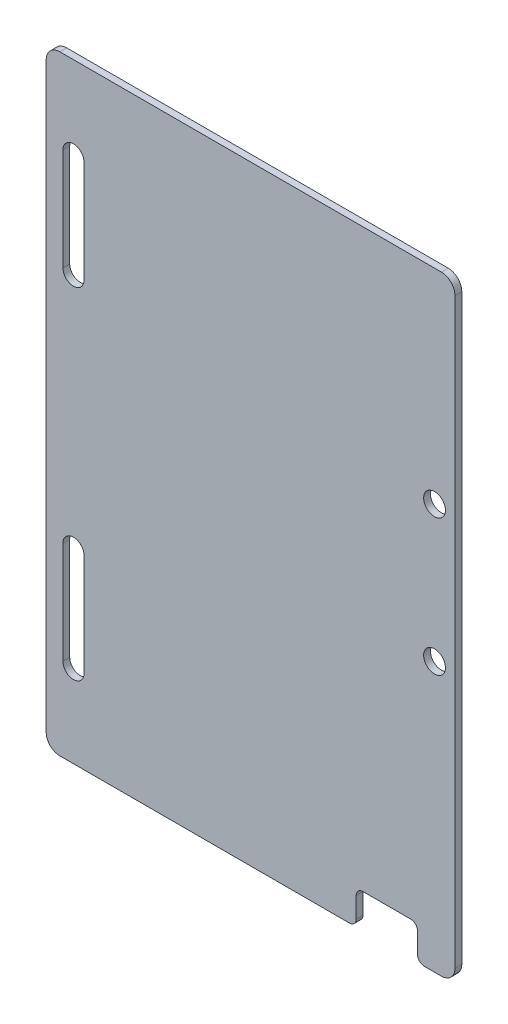
ISO-10303-21;
HEADER;
FILE_DESCRIPTION(('STEP AP214'),'2;1');
FILE_NAME('part.step','',(''),(''),'','','');
FILE_SCHEMA(('AUTOMOTIVE_DESIGN { 1 0 10303 214 1 1 1 1 }'));
ENDSEC;
DATA;
#1=APPLICATION_CONTEXT('core data for automotive mechanical design processes');
#2=APPLICATION_PROTOCOL_DEFINITION('international standard','automotive_design',2000,#1);
#3=PRODUCT_CONTEXT('',#1,'mechanical');
#4=PRODUCT('Part','Part','',(#3));
#5=PRODUCT_RELATED_PRODUCT_CATEGORY('part','',(#4));
#6=PRODUCT_DEFINITION_FORMATION('','',#4);
#7=PRODUCT_DEFINITION_CONTEXT('part definition',#1,'design');
#8=PRODUCT_DEFINITION('design','',#6,#7);
#9=PRODUCT_DEFINITION_SHAPE('','',#8);
#10=(LENGTH_UNIT() NAMED_UNIT(*) SI_UNIT(.MILLI.,.METRE.));
#11=(NAMED_UNIT(*) PLANE_ANGLE_UNIT() SI_UNIT($,.RADIAN.));
#12=(NAMED_UNIT(*) SI_UNIT($,.STERADIAN.) SOLID_ANGLE_UNIT());
#13=UNCERTAINTY_MEASURE_WITH_UNIT(LENGTH_MEASURE(1.E-05),#10,'distance_accuracy_value','');
#14=(GEOMETRIC_REPRESENTATION_CONTEXT(3) GLOBAL_UNCERTAINTY_ASSIGNED_CONTEXT((#13)) GLOBAL_UNIT_ASSIGNED_CONTEXT((#10,
#11,#12)) REPRESENTATION_CONTEXT('',''));
#15=CARTESIAN_POINT('',(0.,0.,0.));
#16=DIRECTION('',(0.,0.,1.));
#17=DIRECTION('',(1.,0.,0.));
#18=AXIS2_PLACEMENT_3D('',#15,#16,#17);
#19=CARTESIAN_POINT('',(-30.,-44.75,1.));
#20=DIRECTION('',(0.,1.,0.));
#21=DIRECTION('',(0.,0.,1.));
#22=AXIS2_PLACEMENT_3D('',#19,#20,#21);
#23=PLANE('',#22);
#24=DIRECTION('',(1.,0.,0.));
#25=VECTOR('',#24,1.);
#26=CARTESIAN_POINT('',(-30.,-44.75,0.));
#27=LINE('',#26,#25);
#28=CARTESIAN_POINT('',(-28.,-44.75,0.));
#29=VERTEX_POINT('',#28);
#30=CARTESIAN_POINT('',(14.5,-44.75,0.));
#31=VERTEX_POINT('',#30);
#32=EDGE_CURVE('E270',#29,#31,#27,.T.);
#33=ORIENTED_EDGE('',*,*,#32,.T.);
#34=DIRECTION('',(0.,0.,1.));
#35=VECTOR('',#34,1.);
#36=CARTESIAN_POINT('',(14.5,-44.75,1.));
#37=LINE('',#36,#35);
#38=CARTESIAN_POINT('',(14.5,-44.75,1.));
#39=VERTEX_POINT('',#38);
#40=EDGE_CURVE('E359',#31,#39,#37,.T.);
#41=ORIENTED_EDGE('',*,*,#40,.T.);
#42=DIRECTION('',(1.,0.,0.));
#43=VECTOR('',#42,1.);
#44=CARTESIAN_POINT('',(-30.,-44.75,1.));
#45=LINE('',#44,#43);
#46=CARTESIAN_POINT('',(-28.,-44.75,1.));
#47=VERTEX_POINT('',#46);
#48=EDGE_CURVE('E277',#47,#39,#45,.T.);
#49=ORIENTED_EDGE('',*,*,#48,.F.);
#50=DIRECTION('',(0.,0.,-1.));
#51=VECTOR('',#50,1.);
#52=CARTESIAN_POINT('',(-28.,-44.75,1.));
#53=LINE('',#52,#51);
#54=EDGE_CURVE('E321',#47,#29,#53,.T.);
#55=ORIENTED_EDGE('',*,*,#54,.T.);
#56=EDGE_LOOP('',(#33,#41,#49,#55));
#57=FACE_BOUND('',#56,.T.);
#58=ADVANCED_FACE('F35',(#57),#23,.F.);
#59=CARTESIAN_POINT('',(0.,0.,1.));
#60=DIRECTION('',(0.,0.,-1.));
#61=DIRECTION('',(-1.,0.,0.));
#62=AXIS2_PLACEMENT_3D('',#59,#60,#61);
#63=PLANE('',#62);
#64=ORIENTED_EDGE('',*,*,#48,.T.);
#65=CARTESIAN_POINT('',(14.5,-43.75,1.));
#66=DIRECTION('',(0.,0.,-1.));
#67=DIRECTION('',(-1.,0.,0.));
#68=AXIS2_PLACEMENT_3D('',#65,#66,#67);
#69=CIRCLE('',#68,1.);
#70=CARTESIAN_POINT('',(15.5,-43.75,1.));
#71=VERTEX_POINT('',#70);
#72=EDGE_CURVE('E363',#39,#71,#69,.F.);
#73=ORIENTED_EDGE('',*,*,#72,.T.);
#74=DIRECTION('',(0.,1.,0.));
#75=VECTOR('',#74,1.);
#76=CARTESIAN_POINT('',(15.5,0.,1.));
#77=LINE('',#76,#75);
#78=CARTESIAN_POINT('',(15.5,-40.75,1.));
#79=VERTEX_POINT('',#78);
#80=EDGE_CURVE('E397',#71,#79,#77,.T.);
#81=ORIENTED_EDGE('',*,*,#80,.T.);
#82=CARTESIAN_POINT('',(16.5,-40.75,0.999999999999999));
#83=DIRECTION('',(0.,0.,-1.));
#84=DIRECTION('',(-1.,0.,0.));
#85=AXIS2_PLACEMENT_3D('',#82,#83,#84);
#86=CIRCLE('',#85,1.);
#87=CARTESIAN_POINT('',(16.5,-39.75,1.));
#88=VERTEX_POINT('',#87);
#89=EDGE_CURVE('E11',#79,#88,#86,.T.);
#90=ORIENTED_EDGE('',*,*,#89,.T.);
#91=DIRECTION('',(1.,0.,0.));
#92=VECTOR('',#91,1.);
#93=CARTESIAN_POINT('',(0.,-39.75,1.));
#94=LINE('',#93,#92);
#95=CARTESIAN_POINT('',(23.5,-39.75,1.));
#96=VERTEX_POINT('',#95);
#97=EDGE_CURVE('E236',#88,#96,#94,.T.);
#98=ORIENTED_EDGE('',*,*,#97,.T.);
#99=CARTESIAN_POINT('',(23.5,-40.75,0.999999999999999));
#100=DIRECTION('',(0.,0.,-1.));
#101=DIRECTION('',(-1.,0.,0.));
#102=AXIS2_PLACEMENT_3D('',#99,#100,#101);
#103=CIRCLE('',#102,1.);
#104=CARTESIAN_POINT('',(24.5,-40.75,1.));
#105=VERTEX_POINT('',#104);
#106=EDGE_CURVE('E372',#96,#105,#103,.T.);
#107=ORIENTED_EDGE('',*,*,#106,.T.);
#108=DIRECTION('',(0.,-1.,0.));
#109=VECTOR('',#108,1.);
#110=CARTESIAN_POINT('',(24.5,0.,1.));
#111=LINE('',#110,#109);
#112=CARTESIAN_POINT('',(24.5,-43.75,1.));
#113=VERTEX_POINT('',#112);
#114=EDGE_CURVE('E402',#105,#113,#111,.T.);
#115=ORIENTED_EDGE('',*,*,#114,.T.);
#116=CARTESIAN_POINT('',(25.5,-43.75,1.));
#117=DIRECTION('',(0.,0.,-1.));
#118=DIRECTION('',(-1.,0.,0.));
#119=AXIS2_PLACEMENT_3D('',#116,#117,#118);
#120=CIRCLE('',#119,1.);
#121=CARTESIAN_POINT('',(25.5,-44.75,1.));
#122=VERTEX_POINT('',#121);
#123=EDGE_CURVE('E58',#113,#122,#120,.F.);
#124=ORIENTED_EDGE('',*,*,#123,.T.);
#125=CARTESIAN_POINT('',(28.,-44.75,1.));
#126=VERTEX_POINT('',#125);
#127=EDGE_CURVE('E276',#122,#126,#45,.T.);
#128=ORIENTED_EDGE('',*,*,#127,.T.);
#129=CARTESIAN_POINT('',(28.,-42.75,1.));
#130=DIRECTION('',(0.,0.,-1.));
#131=DIRECTION('',(-1.,0.,0.));
#132=AXIS2_PLACEMENT_3D('',#129,#130,#131);
#133=CIRCLE('',#132,2.);
#134=CARTESIAN_POINT('',(30.,-42.75,1.));
#135=VERTEX_POINT('',#134);
#136=EDGE_CURVE('E333',#126,#135,#133,.F.);
#137=ORIENTED_EDGE('',*,*,#136,.T.);
#138=DIRECTION('',(0.,1.,0.));
#139=VECTOR('',#138,1.);
#140=CARTESIAN_POINT('',(30.,-44.75,1.));
#141=LINE('',#140,#139);
#142=CARTESIAN_POINT('',(30.,42.75,1.));
#143=VERTEX_POINT('',#142);
#144=EDGE_CURVE('E266',#135,#143,#141,.T.);
#145=ORIENTED_EDGE('',*,*,#144,.T.);
#146=CARTESIAN_POINT('',(28.,42.75,1.));
#147=DIRECTION('',(0.,0.,-1.));
#148=DIRECTION('',(-1.,0.,0.));
#149=AXIS2_PLACEMENT_3D('',#146,#147,#148);
#150=CIRCLE('',#149,2.);
#151=CARTESIAN_POINT('',(28.,44.75,1.));
#152=VERTEX_POINT('',#151);
#153=EDGE_CURVE('E329',#143,#152,#150,.F.);
#154=ORIENTED_EDGE('',*,*,#153,.T.);
#155=DIRECTION('',(-1.,0.,0.));
#156=VECTOR('',#155,1.);
#157=CARTESIAN_POINT('',(-30.,44.75,1.));
#158=LINE('',#157,#156);
#159=CARTESIAN_POINT('',(-28.,44.75,1.));
#160=VERTEX_POINT('',#159);
#161=EDGE_CURVE('E269',#152,#160,#158,.T.);
#162=ORIENTED_EDGE('',*,*,#161,.T.);
#163=CARTESIAN_POINT('',(-28.,42.75,1.));
#164=DIRECTION('',(0.,0.,-1.));
#165=DIRECTION('',(-1.,0.,0.));
#166=AXIS2_PLACEMENT_3D('',#163,#164,#165);
#167=CIRCLE('',#166,2.);
#168=CARTESIAN_POINT('',(-30.,42.75,1.));
#169=VERTEX_POINT('',#168);
#170=EDGE_CURVE('E327',#160,#169,#167,.F.);
#171=ORIENTED_EDGE('',*,*,#170,.T.);
#172=DIRECTION('',(0.,-1.,0.));
#173=VECTOR('',#172,1.);
#174=CARTESIAN_POINT('',(-30.,-44.75,1.));
#175=LINE('',#174,#173);
#176=CARTESIAN_POINT('',(-30.,-42.75,1.));
#177=VERTEX_POINT('',#176);
#178=EDGE_CURVE('E273',#169,#177,#175,.T.);
#179=ORIENTED_EDGE('',*,*,#178,.T.);
#180=CARTESIAN_POINT('',(-28.,-42.75,1.));
#181=DIRECTION('',(0.,0.,-1.));
#182=DIRECTION('',(-1.,0.,0.));
#183=AXIS2_PLACEMENT_3D('',#180,#181,#182);
#184=CIRCLE('',#183,2.);
#185=EDGE_CURVE('E331',#177,#47,#184,.F.);
#186=ORIENTED_EDGE('',*,*,#185,.T.);
#187=EDGE_LOOP('',(#64,#73,#81,#90,#98,#107,#115,#124,#128,#137,#145,#154,#162,#171,#179,#186));
#188=FACE_BOUND('',#187,.T.);
#189=DIRECTION('',(0.,-1.,0.));
#190=VECTOR('',#189,1.);
#191=CARTESIAN_POINT('',(-27.55,32.5,1.));
#192=LINE('',#191,#190);
#193=CARTESIAN_POINT('',(-27.55,32.5,1.));
#194=VERTEX_POINT('',#193);
#195=CARTESIAN_POINT('',(-27.55,17.5,1.));
#196=VERTEX_POINT('',#195);
#197=EDGE_CURVE('E213',#194,#196,#192,.T.);
#198=ORIENTED_EDGE('',*,*,#197,.F.);
#199=CARTESIAN_POINT('',(-26.,32.5,1.));
#200=DIRECTION('',(0.,0.,1.));
#201=DIRECTION('',(1.,0.,0.));
#202=AXIS2_PLACEMENT_3D('',#199,#200,#201);
#203=CIRCLE('',#202,1.55);
#204=CARTESIAN_POINT('',(-24.45,32.5,1.));
#205=VERTEX_POINT('',#204);
#206=EDGE_CURVE('E218',#205,#194,#203,.T.);
#207=ORIENTED_EDGE('',*,*,#206,.F.);
#208=DIRECTION('',(0.,1.,0.));
#209=VECTOR('',#208,1.);
#210=CARTESIAN_POINT('',(-24.45,32.5,1.));
#211=LINE('',#210,#209);
#212=CARTESIAN_POINT('',(-24.45,17.5,1.));
#213=VERTEX_POINT('',#212);
#214=EDGE_CURVE('E223',#213,#205,#211,.T.);
#215=ORIENTED_EDGE('',*,*,#214,.F.);
#216=CARTESIAN_POINT('',(-26.,17.5,1.));
#217=DIRECTION('',(0.,0.,1.));
#218=DIRECTION('',(1.,0.,0.));
#219=AXIS2_PLACEMENT_3D('',#216,#217,#218);
#220=CIRCLE('',#219,1.55);
#221=EDGE_CURVE('E202',#196,#213,#220,.T.);
#222=ORIENTED_EDGE('',*,*,#221,.F.);
#223=EDGE_LOOP('',(#198,#207,#215,#222));
#224=FACE_BOUND('',#223,.T.);
#225=DIRECTION('',(0.,-1.,0.));
#226=VECTOR('',#225,1.);
#227=CARTESIAN_POINT('',(-27.55,-17.5,1.));
#228=LINE('',#227,#226);
#229=CARTESIAN_POINT('',(-27.55,-17.5,1.));
#230=VERTEX_POINT('',#229);
#231=CARTESIAN_POINT('',(-27.55,-32.5,1.));
#232=VERTEX_POINT('',#231);
#233=EDGE_CURVE('E235',#230,#232,#228,.T.);
#234=ORIENTED_EDGE('',*,*,#233,.F.);
#235=CARTESIAN_POINT('',(-26.,-17.5,1.));
#236=DIRECTION('',(0.,0.,1.));
#237=DIRECTION('',(1.,0.,0.));
#238=AXIS2_PLACEMENT_3D('',#235,#236,#237);
#239=CIRCLE('',#238,1.55);
#240=CARTESIAN_POINT('',(-24.45,-17.5,1.));
#241=VERTEX_POINT('',#240);
#242=EDGE_CURVE('E233',#241,#230,#239,.T.);
#243=ORIENTED_EDGE('',*,*,#242,.F.);
#244=DIRECTION('',(0.,1.,0.));
#245=VECTOR('',#244,1.);
#246=CARTESIAN_POINT('',(-24.45,-17.5,1.));
#247=LINE('',#246,#245);
#248=CARTESIAN_POINT('',(-24.45,-32.5,1.));
#249=VERTEX_POINT('',#248);
#250=EDGE_CURVE('E242',#249,#241,#247,.T.);
#251=ORIENTED_EDGE('',*,*,#250,.F.);
#252=CARTESIAN_POINT('',(-26.,-32.5,1.));
#253=DIRECTION('',(0.,0.,1.));
#254=DIRECTION('',(1.,0.,0.));
#255=AXIS2_PLACEMENT_3D('',#252,#253,#254);
#256=CIRCLE('',#255,1.55);
#257=EDGE_CURVE('E239',#232,#249,#256,.T.);
#258=ORIENTED_EDGE('',*,*,#257,.F.);
#259=EDGE_LOOP('',(#234,#243,#251,#258));
#260=FACE_BOUND('',#259,.T.);
#261=CARTESIAN_POINT('',(27.,14.75,1.));
#262=DIRECTION('',(0.,0.,1.));
#263=DIRECTION('',(1.,0.,0.));
#264=AXIS2_PLACEMENT_3D('',#261,#262,#263);
#265=CIRCLE('',#264,1.6);
#266=CARTESIAN_POINT('',(28.6,14.75,1.));
#267=VERTEX_POINT('',#266);
#268=EDGE_CURVE('E260',#267,#267,#265,.T.);
#269=ORIENTED_EDGE('',*,*,#268,.F.);
#270=EDGE_LOOP('',(#269));
#271=FACE_BOUND('',#270,.T.);
#272=CARTESIAN_POINT('',(27.,-5.25000000000001,1.));
#273=DIRECTION('',(0.,0.,1.));
#274=DIRECTION('',(1.,0.,0.));
#275=AXIS2_PLACEMENT_3D('',#272,#273,#274);
#276=CIRCLE('',#275,1.6);
#277=CARTESIAN_POINT('',(28.6,-5.25000000000001,1.));
#278=VERTEX_POINT('',#277);
#279=EDGE_CURVE('E254',#278,#278,#276,.T.);
#280=ORIENTED_EDGE('',*,*,#279,.F.);
#281=EDGE_LOOP('',(#280));
#282=FACE_BOUND('',#281,.T.);
#283=ADVANCED_FACE('F220',(#188,#224,#260,#271,#282),#63,.F.);
#284=CARTESIAN_POINT('',(0.,0.,0.));
#285=DIRECTION('',(0.,0.,-1.));
#286=DIRECTION('',(-1.,0.,0.));
#287=AXIS2_PLACEMENT_3D('',#284,#285,#286);
#288=PLANE('',#287);
#289=DIRECTION('',(0.,1.,0.));
#290=VECTOR('',#289,1.);
#291=CARTESIAN_POINT('',(15.5,-49.75,0.));
#292=LINE('',#291,#290);
#293=CARTESIAN_POINT('',(15.5,-43.75,0.));
#294=VERTEX_POINT('',#293);
#295=CARTESIAN_POINT('',(15.5,-40.75,0.));
#296=VERTEX_POINT('',#295);
#297=EDGE_CURVE('E379',#294,#296,#292,.T.);
#298=ORIENTED_EDGE('',*,*,#297,.F.);
#299=CARTESIAN_POINT('',(14.5,-43.75,0.));
#300=DIRECTION('',(0.,0.,-1.));
#301=DIRECTION('',(-1.,0.,0.));
#302=AXIS2_PLACEMENT_3D('',#299,#300,#301);
#303=CIRCLE('',#302,1.);
#304=EDGE_CURVE('E366',#294,#31,#303,.T.);
#305=ORIENTED_EDGE('',*,*,#304,.T.);
#306=ORIENTED_EDGE('',*,*,#32,.F.);
#307=CARTESIAN_POINT('',(-28.,-42.75,0.));
#308=DIRECTION('',(0.,0.,-1.));
#309=DIRECTION('',(-1.,0.,0.));
#310=AXIS2_PLACEMENT_3D('',#307,#308,#309);
#311=CIRCLE('',#310,2.);
#312=CARTESIAN_POINT('',(-30.,-42.75,0.));
#313=VERTEX_POINT('',#312);
#314=EDGE_CURVE('E316',#29,#313,#311,.T.);
#315=ORIENTED_EDGE('',*,*,#314,.T.);
#316=DIRECTION('',(0.,-1.,0.));
#317=VECTOR('',#316,1.);
#318=CARTESIAN_POINT('',(-30.,-44.75,0.));
#319=LINE('',#318,#317);
#320=CARTESIAN_POINT('',(-30.,42.75,0.));
#321=VERTEX_POINT('',#320);
#322=EDGE_CURVE('E286',#321,#313,#319,.T.);
#323=ORIENTED_EDGE('',*,*,#322,.F.);
#324=CARTESIAN_POINT('',(-28.,42.75,0.));
#325=DIRECTION('',(0.,0.,-1.));
#326=DIRECTION('',(-1.,0.,0.));
#327=AXIS2_PLACEMENT_3D('',#324,#325,#326);
#328=CIRCLE('',#327,2.);
#329=CARTESIAN_POINT('',(-28.,44.75,0.));
#330=VERTEX_POINT('',#329);
#331=EDGE_CURVE('E312',#321,#330,#328,.T.);
#332=ORIENTED_EDGE('',*,*,#331,.T.);
#333=DIRECTION('',(-1.,0.,0.));
#334=VECTOR('',#333,1.);
#335=CARTESIAN_POINT('',(-30.,44.75,0.));
#336=LINE('',#335,#334);
#337=CARTESIAN_POINT('',(28.,44.75,0.));
#338=VERTEX_POINT('',#337);
#339=EDGE_CURVE('E283',#338,#330,#336,.T.);
#340=ORIENTED_EDGE('',*,*,#339,.F.);
#341=CARTESIAN_POINT('',(28.,42.75,0.));
#342=DIRECTION('',(0.,0.,-1.));
#343=DIRECTION('',(-1.,0.,0.));
#344=AXIS2_PLACEMENT_3D('',#341,#342,#343);
#345=CIRCLE('',#344,2.);
#346=CARTESIAN_POINT('',(30.,42.75,0.));
#347=VERTEX_POINT('',#346);
#348=EDGE_CURVE('E314',#338,#347,#345,.T.);
#349=ORIENTED_EDGE('',*,*,#348,.T.);
#350=DIRECTION('',(0.,1.,0.));
#351=VECTOR('',#350,1.);
#352=CARTESIAN_POINT('',(30.,-44.75,0.));
#353=LINE('',#352,#351);
#354=CARTESIAN_POINT('',(30.,-42.75,0.));
#355=VERTEX_POINT('',#354);
#356=EDGE_CURVE('E263',#355,#347,#353,.T.);
#357=ORIENTED_EDGE('',*,*,#356,.F.);
#358=CARTESIAN_POINT('',(28.,-42.75,0.));
#359=DIRECTION('',(0.,0.,-1.));
#360=DIRECTION('',(-1.,0.,0.));
#361=AXIS2_PLACEMENT_3D('',#358,#359,#360);
#362=CIRCLE('',#361,2.);
#363=CARTESIAN_POINT('',(28.,-44.75,0.));
#364=VERTEX_POINT('',#363);
#365=EDGE_CURVE('E318',#355,#364,#362,.T.);
#366=ORIENTED_EDGE('',*,*,#365,.T.);
#367=CARTESIAN_POINT('',(25.5,-44.75,0.));
#368=VERTEX_POINT('',#367);
#369=EDGE_CURVE('E289',#368,#364,#27,.T.);
#370=ORIENTED_EDGE('',*,*,#369,.F.);
#371=CARTESIAN_POINT('',(25.5,-43.75,0.));
#372=DIRECTION('',(0.,0.,-1.));
#373=DIRECTION('',(-1.,0.,0.));
#374=AXIS2_PLACEMENT_3D('',#371,#372,#373);
#375=CIRCLE('',#374,1.);
#376=CARTESIAN_POINT('',(24.5,-43.75,0.));
#377=VERTEX_POINT('',#376);
#378=EDGE_CURVE('E50',#368,#377,#375,.T.);
#379=ORIENTED_EDGE('',*,*,#378,.T.);
#380=DIRECTION('',(0.,-1.,0.));
#381=VECTOR('',#380,1.);
#382=CARTESIAN_POINT('',(24.5,-49.75,0.));
#383=LINE('',#382,#381);
#384=CARTESIAN_POINT('',(24.5,-40.75,0.));
#385=VERTEX_POINT('',#384);
#386=EDGE_CURVE('E467',#385,#377,#383,.T.);
#387=ORIENTED_EDGE('',*,*,#386,.F.);
#388=CARTESIAN_POINT('',(23.5,-40.75,0.));
#389=DIRECTION('',(0.,0.,-1.));
#390=DIRECTION('',(-1.,0.,0.));
#391=AXIS2_PLACEMENT_3D('',#388,#389,#390);
#392=CIRCLE('',#391,1.);
#393=CARTESIAN_POINT('',(23.5,-39.75,0.));
#394=VERTEX_POINT('',#393);
#395=EDGE_CURVE('E370',#385,#394,#392,.F.);
#396=ORIENTED_EDGE('',*,*,#395,.T.);
#397=DIRECTION('',(1.,0.,0.));
#398=VECTOR('',#397,1.);
#399=CARTESIAN_POINT('',(24.5,-39.75,0.));
#400=LINE('',#399,#398);
#401=CARTESIAN_POINT('',(16.5,-39.75,0.));
#402=VERTEX_POINT('',#401);
#403=EDGE_CURVE('E382',#402,#394,#400,.T.);
#404=ORIENTED_EDGE('',*,*,#403,.F.);
#405=CARTESIAN_POINT('',(16.5,-40.75,0.));
#406=DIRECTION('',(0.,0.,-1.));
#407=DIRECTION('',(-1.,0.,0.));
#408=AXIS2_PLACEMENT_3D('',#405,#406,#407);
#409=CIRCLE('',#408,1.);
#410=EDGE_CURVE('E43',#402,#296,#409,.F.);
#411=ORIENTED_EDGE('',*,*,#410,.T.);
#412=EDGE_LOOP('',(#298,#305,#306,#315,#323,#332,#340,#349,#357,#366,#370,#379,#387,#396,#404,#411));
#413=FACE_BOUND('',#412,.T.);
#414=CARTESIAN_POINT('',(-26.,32.5,0.));
#415=DIRECTION('',(0.,0.,-1.));
#416=DIRECTION('',(-1.,0.,0.));
#417=AXIS2_PLACEMENT_3D('',#414,#415,#416);
#418=CIRCLE('',#417,1.55);
#419=CARTESIAN_POINT('',(-27.55,32.5,0.));
#420=VERTEX_POINT('',#419);
#421=CARTESIAN_POINT('',(-24.45,32.5,0.));
#422=VERTEX_POINT('',#421);
#423=EDGE_CURVE('E305',#420,#422,#418,.T.);
#424=ORIENTED_EDGE('',*,*,#423,.F.);
#425=DIRECTION('',(0.,1.,0.));
#426=VECTOR('',#425,1.);
#427=CARTESIAN_POINT('',(-27.55,0.,0.));
#428=LINE('',#427,#426);
#429=CARTESIAN_POINT('',(-27.55,17.5,0.));
#430=VERTEX_POINT('',#429);
#431=EDGE_CURVE('E300',#430,#420,#428,.T.);
#432=ORIENTED_EDGE('',*,*,#431,.F.);
#433=CARTESIAN_POINT('',(-26.,17.5,0.));
#434=DIRECTION('',(0.,0.,-1.));
#435=DIRECTION('',(-1.,0.,0.));
#436=AXIS2_PLACEMENT_3D('',#433,#434,#435);
#437=CIRCLE('',#436,1.55);
#438=CARTESIAN_POINT('',(-24.45,17.5,0.));
#439=VERTEX_POINT('',#438);
#440=EDGE_CURVE('E205',#439,#430,#437,.T.);
#441=ORIENTED_EDGE('',*,*,#440,.F.);
#442=DIRECTION('',(0.,-1.,0.));
#443=VECTOR('',#442,1.);
#444=CARTESIAN_POINT('',(-24.45,0.,0.));
#445=LINE('',#444,#443);
#446=EDGE_CURVE('E303',#422,#439,#445,.T.);
#447=ORIENTED_EDGE('',*,*,#446,.F.);
#448=EDGE_LOOP('',(#424,#432,#441,#447));
#449=FACE_BOUND('',#448,.T.);
#450=CARTESIAN_POINT('',(-26.,-17.5,0.));
#451=DIRECTION('',(0.,0.,-1.));
#452=DIRECTION('',(-1.,0.,0.));
#453=AXIS2_PLACEMENT_3D('',#450,#451,#452);
#454=CIRCLE('',#453,1.55);
#455=CARTESIAN_POINT('',(-27.55,-17.5,0.));
#456=VERTEX_POINT('',#455);
#457=CARTESIAN_POINT('',(-24.45,-17.5,0.));
#458=VERTEX_POINT('',#457);
#459=EDGE_CURVE('E298',#456,#458,#454,.T.);
#460=ORIENTED_EDGE('',*,*,#459,.F.);
#461=DIRECTION('',(0.,1.,0.));
#462=VECTOR('',#461,1.);
#463=CARTESIAN_POINT('',(-27.55,0.,0.));
#464=LINE('',#463,#462);
#465=CARTESIAN_POINT('',(-27.55,-32.5,0.));
#466=VERTEX_POINT('',#465);
#467=EDGE_CURVE('E280',#466,#456,#464,.T.);
#468=ORIENTED_EDGE('',*,*,#467,.F.);
#469=CARTESIAN_POINT('',(-26.,-32.5,0.));
#470=DIRECTION('',(0.,0.,-1.));
#471=DIRECTION('',(-1.,0.,0.));
#472=AXIS2_PLACEMENT_3D('',#469,#470,#471);
#473=CIRCLE('',#472,1.55);
#474=CARTESIAN_POINT('',(-24.45,-32.5,0.));
#475=VERTEX_POINT('',#474);
#476=EDGE_CURVE('E293',#475,#466,#473,.T.);
#477=ORIENTED_EDGE('',*,*,#476,.F.);
#478=DIRECTION('',(0.,-1.,0.));
#479=VECTOR('',#478,1.);
#480=CARTESIAN_POINT('',(-24.45,0.,0.));
#481=LINE('',#480,#479);
#482=EDGE_CURVE('E296',#458,#475,#481,.T.);
#483=ORIENTED_EDGE('',*,*,#482,.F.);
#484=EDGE_LOOP('',(#460,#468,#477,#483));
#485=FACE_BOUND('',#484,.T.);
#486=CARTESIAN_POINT('',(27.,14.75,0.));
#487=DIRECTION('',(0.,0.,1.));
#488=DIRECTION('',(1.,0.,0.));
#489=AXIS2_PLACEMENT_3D('',#486,#487,#488);
#490=CIRCLE('',#489,1.6);
#491=CARTESIAN_POINT('',(28.6,14.75,0.));
#492=VERTEX_POINT('',#491);
#493=EDGE_CURVE('E257',#492,#492,#490,.T.);
#494=ORIENTED_EDGE('',*,*,#493,.T.);
#495=EDGE_LOOP('',(#494));
#496=FACE_BOUND('',#495,.T.);
#497=CARTESIAN_POINT('',(27.,-5.25000000000001,0.));
#498=DIRECTION('',(0.,0.,1.));
#499=DIRECTION('',(1.,0.,0.));
#500=AXIS2_PLACEMENT_3D('',#497,#498,#499);
#501=CIRCLE('',#500,1.6);
#502=CARTESIAN_POINT('',(28.6,-5.25000000000001,0.));
#503=VERTEX_POINT('',#502);
#504=EDGE_CURVE('E230',#503,#503,#501,.T.);
#505=ORIENTED_EDGE('',*,*,#504,.T.);
#506=EDGE_LOOP('',(#505));
#507=FACE_BOUND('',#506,.T.);
#508=ADVANCED_FACE('F377',(#413,#449,#485,#496,#507),#288,.T.);
#509=CARTESIAN_POINT('',(30.,-44.75,1.));
#510=DIRECTION('',(-1.,0.,0.));
#511=DIRECTION('',(0.,-1.,0.));
#512=AXIS2_PLACEMENT_3D('',#509,#510,#511);
#513=PLANE('',#512);
#514=ORIENTED_EDGE('',*,*,#144,.F.);
#515=DIRECTION('',(0.,0.,-1.));
#516=VECTOR('',#515,1.);
#517=CARTESIAN_POINT('',(30.,-42.75,1.));
#518=LINE('',#517,#516);
#519=EDGE_CURVE('E309',#135,#355,#518,.T.);
#520=ORIENTED_EDGE('',*,*,#519,.T.);
#521=ORIENTED_EDGE('',*,*,#356,.T.);
#522=DIRECTION('',(0.,0.,-1.));
#523=VECTOR('',#522,1.);
#524=CARTESIAN_POINT('',(30.,42.75,1.));
#525=LINE('',#524,#523);
#526=EDGE_CURVE('E307',#347,#143,#525,.F.);
#527=ORIENTED_EDGE('',*,*,#526,.T.);
#528=EDGE_LOOP('',(#514,#520,#521,#527));
#529=FACE_BOUND('',#528,.T.);
#530=ADVANCED_FACE('F414',(#529),#513,.F.);
#531=CARTESIAN_POINT('',(-30.,44.75,1.));
#532=DIRECTION('',(0.,-1.,0.));
#533=DIRECTION('',(0.,0.,-1.));
#534=AXIS2_PLACEMENT_3D('',#531,#532,#533);
#535=PLANE('',#534);
#536=ORIENTED_EDGE('',*,*,#161,.F.);
#537=DIRECTION('',(0.,0.,-1.));
#538=VECTOR('',#537,1.);
#539=CARTESIAN_POINT('',(28.,44.75,1.));
#540=LINE('',#539,#538);
#541=EDGE_CURVE('E342',#152,#338,#540,.T.);
#542=ORIENTED_EDGE('',*,*,#541,.T.);
#543=ORIENTED_EDGE('',*,*,#339,.T.);
#544=DIRECTION('',(0.,0.,-1.));
#545=VECTOR('',#544,1.);
#546=CARTESIAN_POINT('',(-28.,44.75,1.));
#547=LINE('',#546,#545);
#548=EDGE_CURVE('E340',#330,#160,#547,.F.);
#549=ORIENTED_EDGE('',*,*,#548,.T.);
#550=EDGE_LOOP('',(#536,#542,#543,#549));
#551=FACE_BOUND('',#550,.T.);
#552=ADVANCED_FACE('F456',(#551),#535,.F.);
#553=CARTESIAN_POINT('',(-30.,-44.75,1.));
#554=DIRECTION('',(1.,0.,0.));
#555=DIRECTION('',(0.,0.,-1.));
#556=AXIS2_PLACEMENT_3D('',#553,#554,#555);
#557=PLANE('',#556);
#558=ORIENTED_EDGE('',*,*,#322,.T.);
#559=DIRECTION('',(0.,0.,-1.));
#560=VECTOR('',#559,1.);
#561=CARTESIAN_POINT('',(-30.,-42.75,1.));
#562=LINE('',#561,#560);
#563=EDGE_CURVE('E338',#313,#177,#562,.F.);
#564=ORIENTED_EDGE('',*,*,#563,.T.);
#565=ORIENTED_EDGE('',*,*,#178,.F.);
#566=DIRECTION('',(0.,0.,-1.));
#567=VECTOR('',#566,1.);
#568=CARTESIAN_POINT('',(-30.,42.75,1.));
#569=LINE('',#568,#567);
#570=EDGE_CURVE('E335',#169,#321,#569,.T.);
#571=ORIENTED_EDGE('',*,*,#570,.T.);
#572=EDGE_LOOP('',(#558,#564,#565,#571));
#573=FACE_BOUND('',#572,.T.);
#574=ADVANCED_FACE('F450',(#573),#557,.F.);
#575=ORIENTED_EDGE('',*,*,#127,.F.);
#576=DIRECTION('',(0.,0.,-1.));
#577=VECTOR('',#576,1.);
#578=CARTESIAN_POINT('',(25.5,-44.75,1.));
#579=LINE('',#578,#577);
#580=EDGE_CURVE('E368',#122,#368,#579,.T.);
#581=ORIENTED_EDGE('',*,*,#580,.T.);
#582=ORIENTED_EDGE('',*,*,#369,.T.);
#583=DIRECTION('',(0.,0.,-1.));
#584=VECTOR('',#583,1.);
#585=CARTESIAN_POINT('',(28.,-44.75,1.));
#586=LINE('',#585,#584);
#587=EDGE_CURVE('E324',#364,#126,#586,.F.);
#588=ORIENTED_EDGE('',*,*,#587,.T.);
#589=EDGE_LOOP('',(#575,#581,#582,#588));
#590=FACE_BOUND('',#589,.T.);
#591=ADVANCED_FACE('F437',(#590),#23,.F.);
#592=CARTESIAN_POINT('',(27.,14.75,1.));
#593=DIRECTION('',(0.,0.,-1.));
#594=DIRECTION('',(-1.,0.,0.));
#595=AXIS2_PLACEMENT_3D('',#592,#593,#594);
#596=CYLINDRICAL_SURFACE('',#595,1.6);
#597=ORIENTED_EDGE('',*,*,#268,.T.);
#598=EDGE_LOOP('',(#597));
#599=FACE_BOUND('',#598,.T.);
#600=ORIENTED_EDGE('',*,*,#493,.F.);
#601=EDGE_LOOP('',(#600));
#602=FACE_BOUND('',#601,.T.);
#603=ADVANCED_FACE('F427',(#599,#602),#596,.F.);
#604=CARTESIAN_POINT('',(27.,-5.25000000000001,1.));
#605=DIRECTION('',(0.,0.,-1.));
#606=DIRECTION('',(-1.,0.,0.));
#607=AXIS2_PLACEMENT_3D('',#604,#605,#606);
#608=CYLINDRICAL_SURFACE('',#607,1.6);
#609=ORIENTED_EDGE('',*,*,#279,.T.);
#610=EDGE_LOOP('',(#609));
#611=FACE_BOUND('',#610,.T.);
#612=ORIENTED_EDGE('',*,*,#504,.F.);
#613=EDGE_LOOP('',(#612));
#614=FACE_BOUND('',#613,.T.);
#615=ADVANCED_FACE('F424',(#611,#614),#608,.F.);
#616=CARTESIAN_POINT('',(-26.,-17.5,-9.));
#617=DIRECTION('',(0.,0.,1.));
#618=DIRECTION('',(1.,0.,0.));
#619=AXIS2_PLACEMENT_3D('',#616,#617,#618);
#620=CYLINDRICAL_SURFACE('',#619,1.55);
#621=ORIENTED_EDGE('',*,*,#459,.T.);
#622=DIRECTION('',(0.,0.,1.));
#623=VECTOR('',#622,1.);
#624=CARTESIAN_POINT('',(-24.45,-17.5,-9.));
#625=LINE('',#624,#623);
#626=EDGE_CURVE('E246',#458,#241,#625,.T.);
#627=ORIENTED_EDGE('',*,*,#626,.T.);
#628=ORIENTED_EDGE('',*,*,#242,.T.);
#629=DIRECTION('',(0.,0.,1.));
#630=VECTOR('',#629,1.);
#631=CARTESIAN_POINT('',(-27.55,-17.5,-9.));
#632=LINE('',#631,#630);
#633=EDGE_CURVE('E245',#456,#230,#632,.T.);
#634=ORIENTED_EDGE('',*,*,#633,.F.);
#635=EDGE_LOOP('',(#621,#627,#628,#634));
#636=FACE_BOUND('',#635,.T.);
#637=ADVANCED_FACE('F426',(#636),#620,.F.);
#638=CARTESIAN_POINT('',(-24.45,-17.5,-9.));
#639=DIRECTION('',(1.,0.,0.));
#640=DIRECTION('',(0.,1.,0.));
#641=AXIS2_PLACEMENT_3D('',#638,#639,#640);
#642=PLANE('',#641);
#643=ORIENTED_EDGE('',*,*,#482,.T.);
#644=DIRECTION('',(0.,0.,1.));
#645=VECTOR('',#644,1.);
#646=CARTESIAN_POINT('',(-24.45,-32.5,-9.));
#647=LINE('',#646,#645);
#648=EDGE_CURVE('E248',#475,#249,#647,.T.);
#649=ORIENTED_EDGE('',*,*,#648,.T.);
#650=ORIENTED_EDGE('',*,*,#250,.T.);
#651=ORIENTED_EDGE('',*,*,#626,.F.);
#652=EDGE_LOOP('',(#643,#649,#650,#651));
#653=FACE_BOUND('',#652,.T.);
#654=ADVANCED_FACE('F434',(#653),#642,.F.);
#655=CARTESIAN_POINT('',(-26.,-32.5,-9.));
#656=DIRECTION('',(0.,0.,1.));
#657=DIRECTION('',(1.,0.,0.));
#658=AXIS2_PLACEMENT_3D('',#655,#656,#657);
#659=CYLINDRICAL_SURFACE('',#658,1.55);
#660=ORIENTED_EDGE('',*,*,#476,.T.);
#661=DIRECTION('',(0.,0.,1.));
#662=VECTOR('',#661,1.);
#663=CARTESIAN_POINT('',(-27.55,-32.5,-9.));
#664=LINE('',#663,#662);
#665=EDGE_CURVE('E250',#466,#232,#664,.T.);
#666=ORIENTED_EDGE('',*,*,#665,.T.);
#667=ORIENTED_EDGE('',*,*,#257,.T.);
#668=ORIENTED_EDGE('',*,*,#648,.F.);
#669=EDGE_LOOP('',(#660,#666,#667,#668));
#670=FACE_BOUND('',#669,.T.);
#671=ADVANCED_FACE('F560',(#670),#659,.F.);
#672=CARTESIAN_POINT('',(-27.55,-17.5,-9.));
#673=DIRECTION('',(-1.,0.,0.));
#674=DIRECTION('',(0.,-1.,0.));
#675=AXIS2_PLACEMENT_3D('',#672,#673,#674);
#676=PLANE('',#675);
#677=ORIENTED_EDGE('',*,*,#467,.T.);
#678=ORIENTED_EDGE('',*,*,#633,.T.);
#679=ORIENTED_EDGE('',*,*,#233,.T.);
#680=ORIENTED_EDGE('',*,*,#665,.F.);
#681=EDGE_LOOP('',(#677,#678,#679,#680));
#682=FACE_BOUND('',#681,.T.);
#683=ADVANCED_FACE('F570',(#682),#676,.F.);
#684=CARTESIAN_POINT('',(-26.,32.5,-9.));
#685=DIRECTION('',(0.,0.,1.));
#686=DIRECTION('',(1.,0.,0.));
#687=AXIS2_PLACEMENT_3D('',#684,#685,#686);
#688=CYLINDRICAL_SURFACE('',#687,1.55);
#689=ORIENTED_EDGE('',*,*,#423,.T.);
#690=DIRECTION('',(0.,0.,1.));
#691=VECTOR('',#690,1.);
#692=CARTESIAN_POINT('',(-24.45,32.5,-9.));
#693=LINE('',#692,#691);
#694=EDGE_CURVE('E228',#422,#205,#693,.T.);
#695=ORIENTED_EDGE('',*,*,#694,.T.);
#696=ORIENTED_EDGE('',*,*,#206,.T.);
#697=DIRECTION('',(0.,0.,1.));
#698=VECTOR('',#697,1.);
#699=CARTESIAN_POINT('',(-27.55,32.5,-9.));
#700=LINE('',#699,#698);
#701=EDGE_CURVE('E209',#420,#194,#700,.T.);
#702=ORIENTED_EDGE('',*,*,#701,.F.);
#703=EDGE_LOOP('',(#689,#695,#696,#702));
#704=FACE_BOUND('',#703,.T.);
#705=ADVANCED_FACE('F406',(#704),#688,.F.);
#706=CARTESIAN_POINT('',(-24.45,32.5,-9.));
#707=DIRECTION('',(1.,0.,0.));
#708=DIRECTION('',(0.,1.,0.));
#709=AXIS2_PLACEMENT_3D('',#706,#707,#708);
#710=PLANE('',#709);
#711=ORIENTED_EDGE('',*,*,#446,.T.);
#712=DIRECTION('',(0.,0.,1.));
#713=VECTOR('',#712,1.);
#714=CARTESIAN_POINT('',(-24.45,17.5,-9.));
#715=LINE('',#714,#713);
#716=EDGE_CURVE('E208',#439,#213,#715,.T.);
#717=ORIENTED_EDGE('',*,*,#716,.T.);
#718=ORIENTED_EDGE('',*,*,#214,.T.);
#719=ORIENTED_EDGE('',*,*,#694,.F.);
#720=EDGE_LOOP('',(#711,#717,#718,#719));
#721=FACE_BOUND('',#720,.T.);
#722=ADVANCED_FACE('F411',(#721),#710,.F.);
#723=CARTESIAN_POINT('',(-26.,17.5,-9.));
#724=DIRECTION('',(0.,0.,1.));
#725=DIRECTION('',(1.,0.,0.));
#726=AXIS2_PLACEMENT_3D('',#723,#724,#725);
#727=CYLINDRICAL_SURFACE('',#726,1.55);
#728=ORIENTED_EDGE('',*,*,#440,.T.);
#729=DIRECTION('',(0.,0.,1.));
#730=VECTOR('',#729,1.);
#731=CARTESIAN_POINT('',(-27.55,17.5,-9.));
#732=LINE('',#731,#730);
#733=EDGE_CURVE('E197',#430,#196,#732,.T.);
#734=ORIENTED_EDGE('',*,*,#733,.T.);
#735=ORIENTED_EDGE('',*,*,#221,.T.);
#736=ORIENTED_EDGE('',*,*,#716,.F.);
#737=EDGE_LOOP('',(#728,#734,#735,#736));
#738=FACE_BOUND('',#737,.T.);
#739=ADVANCED_FACE('F199',(#738),#727,.F.);
#740=CARTESIAN_POINT('',(-27.55,32.5,-9.));
#741=DIRECTION('',(-1.,0.,0.));
#742=DIRECTION('',(0.,-1.,0.));
#743=AXIS2_PLACEMENT_3D('',#740,#741,#742);
#744=PLANE('',#743);
#745=ORIENTED_EDGE('',*,*,#431,.T.);
#746=ORIENTED_EDGE('',*,*,#701,.T.);
#747=ORIENTED_EDGE('',*,*,#197,.T.);
#748=ORIENTED_EDGE('',*,*,#733,.F.);
#749=EDGE_LOOP('',(#745,#746,#747,#748));
#750=FACE_BOUND('',#749,.T.);
#751=ADVANCED_FACE('F214',(#750),#744,.F.);
#752=CARTESIAN_POINT('',(28.,-42.75,1.));
#753=DIRECTION('',(0.,0.,-1.));
#754=DIRECTION('',(-1.,0.,0.));
#755=AXIS2_PLACEMENT_3D('',#752,#753,#754);
#756=CYLINDRICAL_SURFACE('',#755,2.);
#757=ORIENTED_EDGE('',*,*,#136,.F.);
#758=ORIENTED_EDGE('',*,*,#587,.F.);
#759=ORIENTED_EDGE('',*,*,#365,.F.);
#760=ORIENTED_EDGE('',*,*,#519,.F.);
#761=EDGE_LOOP('',(#757,#758,#759,#760));
#762=FACE_BOUND('',#761,.T.);
#763=ADVANCED_FACE('F475',(#762),#756,.T.);
#764=CARTESIAN_POINT('',(-28.,-42.75,1.));
#765=DIRECTION('',(0.,0.,-1.));
#766=DIRECTION('',(-1.,0.,0.));
#767=AXIS2_PLACEMENT_3D('',#764,#765,#766);
#768=CYLINDRICAL_SURFACE('',#767,2.);
#769=ORIENTED_EDGE('',*,*,#185,.F.);
#770=ORIENTED_EDGE('',*,*,#563,.F.);
#771=ORIENTED_EDGE('',*,*,#314,.F.);
#772=ORIENTED_EDGE('',*,*,#54,.F.);
#773=EDGE_LOOP('',(#769,#770,#771,#772));
#774=FACE_BOUND('',#773,.T.);
#775=ADVANCED_FACE('F496',(#774),#768,.T.);
#776=CARTESIAN_POINT('',(28.,42.75,1.));
#777=DIRECTION('',(0.,0.,-1.));
#778=DIRECTION('',(-1.,0.,0.));
#779=AXIS2_PLACEMENT_3D('',#776,#777,#778);
#780=CYLINDRICAL_SURFACE('',#779,2.);
#781=ORIENTED_EDGE('',*,*,#153,.F.);
#782=ORIENTED_EDGE('',*,*,#526,.F.);
#783=ORIENTED_EDGE('',*,*,#348,.F.);
#784=ORIENTED_EDGE('',*,*,#541,.F.);
#785=EDGE_LOOP('',(#781,#782,#783,#784));
#786=FACE_BOUND('',#785,.T.);
#787=ADVANCED_FACE('F481',(#786),#780,.T.);
#788=CARTESIAN_POINT('',(-28.,42.75,1.));
#789=DIRECTION('',(0.,0.,-1.));
#790=DIRECTION('',(-1.,0.,0.));
#791=AXIS2_PLACEMENT_3D('',#788,#789,#790);
#792=CYLINDRICAL_SURFACE('',#791,2.);
#793=ORIENTED_EDGE('',*,*,#170,.F.);
#794=ORIENTED_EDGE('',*,*,#548,.F.);
#795=ORIENTED_EDGE('',*,*,#331,.F.);
#796=ORIENTED_EDGE('',*,*,#570,.F.);
#797=EDGE_LOOP('',(#793,#794,#795,#796));
#798=FACE_BOUND('',#797,.T.);
#799=ADVANCED_FACE('F489',(#798),#792,.T.);
#800=CARTESIAN_POINT('',(24.5,-39.75,10.));
#801=DIRECTION('',(0.,1.,0.));
#802=DIRECTION('',(0.,0.,1.));
#803=AXIS2_PLACEMENT_3D('',#800,#801,#802);
#804=PLANE('',#803);
#805=ORIENTED_EDGE('',*,*,#403,.T.);
#806=DIRECTION('',(0.,0.,-1.));
#807=VECTOR('',#806,1.);
#808=CARTESIAN_POINT('',(23.5,-39.75,0.999999999999999));
#809=LINE('',#808,#807);
#810=EDGE_CURVE('E353',#394,#96,#809,.F.);
#811=ORIENTED_EDGE('',*,*,#810,.T.);
#812=ORIENTED_EDGE('',*,*,#97,.F.);
#813=DIRECTION('',(0.,0.,-1.));
#814=VECTOR('',#813,1.);
#815=CARTESIAN_POINT('',(16.5,-39.75,0.));
#816=LINE('',#815,#814);
#817=EDGE_CURVE('E350',#88,#402,#816,.T.);
#818=ORIENTED_EDGE('',*,*,#817,.T.);
#819=EDGE_LOOP('',(#805,#811,#812,#818));
#820=FACE_BOUND('',#819,.T.);
#821=ADVANCED_FACE('F399',(#820),#804,.F.);
#822=CARTESIAN_POINT('',(15.5,-49.75,10.));
#823=DIRECTION('',(-1.,0.,0.));
#824=DIRECTION('',(0.,0.,1.));
#825=AXIS2_PLACEMENT_3D('',#822,#823,#824);
#826=PLANE('',#825);
#827=ORIENTED_EDGE('',*,*,#297,.T.);
#828=DIRECTION('',(0.,0.,-1.));
#829=VECTOR('',#828,1.);
#830=CARTESIAN_POINT('',(15.5,-40.75,0.999999999999999));
#831=LINE('',#830,#829);
#832=EDGE_CURVE('E357',#296,#79,#831,.F.);
#833=ORIENTED_EDGE('',*,*,#832,.T.);
#834=ORIENTED_EDGE('',*,*,#80,.F.);
#835=DIRECTION('',(0.,0.,1.));
#836=VECTOR('',#835,1.);
#837=CARTESIAN_POINT('',(15.5,-43.75,10.));
#838=LINE('',#837,#836);
#839=EDGE_CURVE('E355',#71,#294,#838,.F.);
#840=ORIENTED_EDGE('',*,*,#839,.T.);
#841=EDGE_LOOP('',(#827,#833,#834,#840));
#842=FACE_BOUND('',#841,.T.);
#843=ADVANCED_FACE('F387',(#842),#826,.F.);
#844=CARTESIAN_POINT('',(24.5,-49.75,10.));
#845=DIRECTION('',(1.,0.,0.));
#846=DIRECTION('',(0.,0.,-1.));
#847=AXIS2_PLACEMENT_3D('',#844,#845,#846);
#848=PLANE('',#847);
#849=ORIENTED_EDGE('',*,*,#114,.F.);
#850=DIRECTION('',(0.,0.,-1.));
#851=VECTOR('',#850,1.);
#852=CARTESIAN_POINT('',(24.5,-40.75,0.));
#853=LINE('',#852,#851);
#854=EDGE_CURVE('E347',#105,#385,#853,.T.);
#855=ORIENTED_EDGE('',*,*,#854,.T.);
#856=ORIENTED_EDGE('',*,*,#386,.T.);
#857=DIRECTION('',(0.,0.,-1.));
#858=VECTOR('',#857,1.);
#859=CARTESIAN_POINT('',(24.5,-43.75,10.));
#860=LINE('',#859,#858);
#861=EDGE_CURVE('E345',#377,#113,#860,.F.);
#862=ORIENTED_EDGE('',*,*,#861,.T.);
#863=EDGE_LOOP('',(#849,#855,#856,#862));
#864=FACE_BOUND('',#863,.T.);
#865=ADVANCED_FACE('F464',(#864),#848,.F.);
#866=CARTESIAN_POINT('',(23.5,-40.75,10.));
#867=DIRECTION('',(0.,0.,1.));
#868=DIRECTION('',(1.,0.,0.));
#869=AXIS2_PLACEMENT_3D('',#866,#867,#868);
#870=CYLINDRICAL_SURFACE('',#869,1.);
#871=ORIENTED_EDGE('',*,*,#106,.F.);
#872=ORIENTED_EDGE('',*,*,#810,.F.);
#873=ORIENTED_EDGE('',*,*,#395,.F.);
#874=ORIENTED_EDGE('',*,*,#854,.F.);
#875=EDGE_LOOP('',(#871,#872,#873,#874));
#876=FACE_BOUND('',#875,.T.);
#877=ADVANCED_FACE('F471',(#876),#870,.F.);
#878=CARTESIAN_POINT('',(16.5,-40.75,10.));
#879=DIRECTION('',(0.,0.,1.));
#880=DIRECTION('',(1.,0.,0.));
#881=AXIS2_PLACEMENT_3D('',#878,#879,#880);
#882=CYLINDRICAL_SURFACE('',#881,1.);
#883=ORIENTED_EDGE('',*,*,#89,.F.);
#884=ORIENTED_EDGE('',*,*,#832,.F.);
#885=ORIENTED_EDGE('',*,*,#410,.F.);
#886=ORIENTED_EDGE('',*,*,#817,.F.);
#887=EDGE_LOOP('',(#883,#884,#885,#886));
#888=FACE_BOUND('',#887,.T.);
#889=ADVANCED_FACE('F393',(#888),#882,.F.);
#890=CARTESIAN_POINT('',(14.5,-43.75,1.));
#891=DIRECTION('',(0.,0.,1.));
#892=DIRECTION('',(1.,0.,0.));
#893=AXIS2_PLACEMENT_3D('',#890,#891,#892);
#894=CYLINDRICAL_SURFACE('',#893,1.);
#895=ORIENTED_EDGE('',*,*,#304,.F.);
#896=ORIENTED_EDGE('',*,*,#839,.F.);
#897=ORIENTED_EDGE('',*,*,#72,.F.);
#898=ORIENTED_EDGE('',*,*,#40,.F.);
#899=EDGE_LOOP('',(#895,#896,#897,#898));
#900=FACE_BOUND('',#899,.T.);
#901=ADVANCED_FACE('F502',(#900),#894,.T.);
#902=CARTESIAN_POINT('',(25.5,-43.75,1.));
#903=DIRECTION('',(0.,0.,-1.));
#904=DIRECTION('',(-1.,0.,0.));
#905=AXIS2_PLACEMENT_3D('',#902,#903,#904);
#906=CYLINDRICAL_SURFACE('',#905,1.);
#907=ORIENTED_EDGE('',*,*,#123,.F.);
#908=ORIENTED_EDGE('',*,*,#861,.F.);
#909=ORIENTED_EDGE('',*,*,#378,.F.);
#910=ORIENTED_EDGE('',*,*,#580,.F.);
#911=EDGE_LOOP('',(#907,#908,#909,#910));
#912=FACE_BOUND('',#911,.T.);
#913=ADVANCED_FACE('F37',(#912),#906,.T.);
#914=CLOSED_SHELL('',(#58,#283,#508,#530,#552,#574,#591,#603,#615,#637,#654,#671,#683,#705,#722,
#739,#751,#763,#775,#787,#799,#821,#843,#865,#877,#889,#901,#913));
#915=MANIFOLD_SOLID_BREP('B2',#914);
#916=ADVANCED_BREP_SHAPE_REPRESENTATION('',(#18,#915),#14);
#917=SHAPE_DEFINITION_REPRESENTATION(#9,#916);
ENDSEC;
END-ISO-10303-21;
